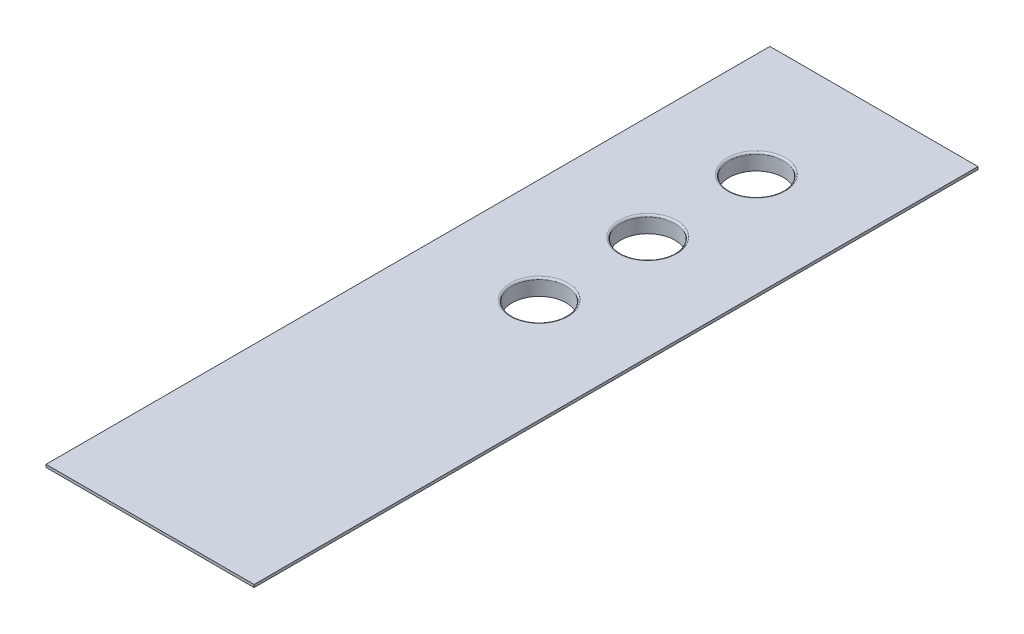
ISO-10303-21;
HEADER;
FILE_DESCRIPTION(('STEP AP214'),'2;1');
FILE_NAME('part.step','',(''),(''),'','','');
FILE_SCHEMA(('AUTOMOTIVE_DESIGN { 1 0 10303 214 1 1 1 1 }'));
ENDSEC;
DATA;
#1=APPLICATION_CONTEXT('core data for automotive mechanical design processes');
#2=APPLICATION_PROTOCOL_DEFINITION('international standard','automotive_design',2000,#1);
#3=PRODUCT_CONTEXT('',#1,'mechanical');
#4=PRODUCT('Part','Part','',(#3));
#5=PRODUCT_RELATED_PRODUCT_CATEGORY('part','',(#4));
#6=PRODUCT_DEFINITION_FORMATION('','',#4);
#7=PRODUCT_DEFINITION_CONTEXT('part definition',#1,'design');
#8=PRODUCT_DEFINITION('design','',#6,#7);
#9=PRODUCT_DEFINITION_SHAPE('','',#8);
#10=(LENGTH_UNIT() NAMED_UNIT(*) SI_UNIT(.MILLI.,.METRE.));
#11=(NAMED_UNIT(*) PLANE_ANGLE_UNIT() SI_UNIT($,.RADIAN.));
#12=(NAMED_UNIT(*) SI_UNIT($,.STERADIAN.) SOLID_ANGLE_UNIT());
#13=UNCERTAINTY_MEASURE_WITH_UNIT(LENGTH_MEASURE(1.E-05),#10,'distance_accuracy_value','');
#14=(GEOMETRIC_REPRESENTATION_CONTEXT(3) GLOBAL_UNCERTAINTY_ASSIGNED_CONTEXT((#13)) GLOBAL_UNIT_ASSIGNED_CONTEXT((#10,
#11,#12)) REPRESENTATION_CONTEXT('',''));
#15=CARTESIAN_POINT('',(0.,0.,0.));
#16=DIRECTION('',(0.,0.,1.));
#17=DIRECTION('',(1.,0.,0.));
#18=AXIS2_PLACEMENT_3D('',#15,#16,#17);
#19=CARTESIAN_POINT('',(-295.590216374017,-35.4988746672799,-138.330525501));
#20=DIRECTION('',(0.,1.,0.));
#21=DIRECTION('',(0.,0.,1.));
#22=AXIS2_PLACEMENT_3D('',#19,#20,#21);
#23=PLANE('',#22);
#24=CARTESIAN_POINT('',(-295.590216374017,-35.4988746672799,-138.330525501));
#25=DIRECTION('',(0.,1.,0.));
#26=DIRECTION('',(0.,0.,1.));
#27=AXIS2_PLACEMENT_3D('',#24,#25,#26);
#28=CIRCLE('',#27,3.29999999999997);
#29=CARTESIAN_POINT('',(-295.590216374017,-35.4988746672799,-135.030525501));
#30=VERTEX_POINT('',#29);
#31=EDGE_CURVE('E19',#30,#30,#28,.T.);
#32=ORIENTED_EDGE('',*,*,#31,.F.);
#33=EDGE_LOOP('',(#32));
#34=FACE_BOUND('',#33,.T.);
#35=CARTESIAN_POINT('',(-295.590216374017,-35.4988746672799,-138.330525501));
#36=DIRECTION('',(0.,1.,0.));
#37=DIRECTION('',(0.,0.,1.));
#38=AXIS2_PLACEMENT_3D('',#35,#36,#37);
#39=CIRCLE('',#38,3.);
#40=CARTESIAN_POINT('',(-295.590216374017,-35.4988746672799,-135.330525501));
#41=VERTEX_POINT('',#40);
#42=EDGE_CURVE('E165',#41,#41,#39,.T.);
#43=ORIENTED_EDGE('',*,*,#42,.T.);
#44=EDGE_LOOP('',(#43));
#45=FACE_BOUND('',#44,.T.);
#46=ADVANCED_FACE('F16',(#34,#45),#23,.F.);
#47=CARTESIAN_POINT('',(-295.590216374017,-35.4988746672799,-126.330525501));
#48=DIRECTION('',(0.,1.,0.));
#49=DIRECTION('',(0.,0.,1.));
#50=AXIS2_PLACEMENT_3D('',#47,#48,#49);
#51=PLANE('',#50);
#52=CARTESIAN_POINT('',(-295.590216374017,-35.4988746672799,-126.330525501));
#53=DIRECTION('',(0.,1.,0.));
#54=DIRECTION('',(0.,0.,1.));
#55=AXIS2_PLACEMENT_3D('',#52,#53,#54);
#56=CIRCLE('',#55,3.29999999999998);
#57=CARTESIAN_POINT('',(-295.590216374017,-35.4988746672799,-123.030525501));
#58=VERTEX_POINT('',#57);
#59=EDGE_CURVE('E170',#58,#58,#56,.T.);
#60=ORIENTED_EDGE('',*,*,#59,.F.);
#61=EDGE_LOOP('',(#60));
#62=FACE_BOUND('',#61,.T.);
#63=CARTESIAN_POINT('',(-295.590216374017,-35.4988746672799,-126.330525501));
#64=DIRECTION('',(0.,1.,0.));
#65=DIRECTION('',(0.,0.,1.));
#66=AXIS2_PLACEMENT_3D('',#63,#64,#65);
#67=CIRCLE('',#66,2.99999999999999);
#68=CARTESIAN_POINT('',(-295.590216374017,-35.4988746672799,-123.330525501));
#69=VERTEX_POINT('',#68);
#70=EDGE_CURVE('E162',#69,#69,#67,.T.);
#71=ORIENTED_EDGE('',*,*,#70,.T.);
#72=EDGE_LOOP('',(#71));
#73=FACE_BOUND('',#72,.T.);
#74=ADVANCED_FACE('F182',(#62,#73),#51,.F.);
#75=CARTESIAN_POINT('',(-295.590216374017,-35.4988746672799,-114.330525501));
#76=DIRECTION('',(0.,1.,0.));
#77=DIRECTION('',(0.,0.,1.));
#78=AXIS2_PLACEMENT_3D('',#75,#76,#77);
#79=PLANE('',#78);
#80=CARTESIAN_POINT('',(-295.590216374017,-35.4988746672799,-114.330525501));
#81=DIRECTION('',(0.,1.,0.));
#82=DIRECTION('',(0.,0.,1.));
#83=AXIS2_PLACEMENT_3D('',#80,#81,#82);
#84=CIRCLE('',#83,3.29999999999998);
#85=CARTESIAN_POINT('',(-295.590216374017,-35.4988746672799,-111.030525501));
#86=VERTEX_POINT('',#85);
#87=EDGE_CURVE('E168',#86,#86,#84,.T.);
#88=ORIENTED_EDGE('',*,*,#87,.F.);
#89=EDGE_LOOP('',(#88));
#90=FACE_BOUND('',#89,.T.);
#91=CARTESIAN_POINT('',(-295.590216374017,-35.4988746672799,-114.330525501));
#92=DIRECTION('',(0.,1.,0.));
#93=DIRECTION('',(0.,0.,1.));
#94=AXIS2_PLACEMENT_3D('',#91,#92,#93);
#95=CIRCLE('',#94,2.99999999999999);
#96=CARTESIAN_POINT('',(-295.590216374017,-35.4988746672799,-111.330525501));
#97=VERTEX_POINT('',#96);
#98=EDGE_CURVE('E159',#97,#97,#95,.T.);
#99=ORIENTED_EDGE('',*,*,#98,.T.);
#100=EDGE_LOOP('',(#99));
#101=FACE_BOUND('',#100,.T.);
#102=ADVANCED_FACE('F324',(#90,#101),#79,.F.);
#103=CARTESIAN_POINT('',(-295.590216374017,-35.4988746672799,-138.330525501));
#104=DIRECTION('',(0.,1.,0.));
#105=DIRECTION('',(0.,0.,1.));
#106=AXIS2_PLACEMENT_3D('',#103,#104,#105);
#107=CYLINDRICAL_SURFACE('',#106,3.29999999999997);
#108=ORIENTED_EDGE('',*,*,#31,.T.);
#109=EDGE_LOOP('',(#108));
#110=FACE_BOUND('',#109,.T.);
#111=CARTESIAN_POINT('',(-295.590216374017,-33.9988746672799,-138.330525501));
#112=DIRECTION('',(0.,1.,0.));
#113=DIRECTION('',(0.,0.,1.));
#114=AXIS2_PLACEMENT_3D('',#111,#112,#113);
#115=CIRCLE('',#114,3.29999999999997);
#116=CARTESIAN_POINT('',(-295.590216374017,-33.9988746672799,-135.030525501));
#117=VERTEX_POINT('',#116);
#118=EDGE_CURVE('E156',#117,#117,#115,.T.);
#119=ORIENTED_EDGE('',*,*,#118,.F.);
#120=EDGE_LOOP('',(#119));
#121=FACE_BOUND('',#120,.T.);
#122=ADVANCED_FACE('F177',(#110,#121),#107,.T.);
#123=CARTESIAN_POINT('',(-295.590216374017,-35.4988746672799,-126.330525501));
#124=DIRECTION('',(0.,1.,0.));
#125=DIRECTION('',(0.,0.,1.));
#126=AXIS2_PLACEMENT_3D('',#123,#124,#125);
#127=CYLINDRICAL_SURFACE('',#126,3.29999999999998);
#128=ORIENTED_EDGE('',*,*,#59,.T.);
#129=EDGE_LOOP('',(#128));
#130=FACE_BOUND('',#129,.T.);
#131=CARTESIAN_POINT('',(-295.590216374017,-33.9988746672799,-126.330525501));
#132=DIRECTION('',(0.,1.,0.));
#133=DIRECTION('',(0.,0.,1.));
#134=AXIS2_PLACEMENT_3D('',#131,#132,#133);
#135=CIRCLE('',#134,3.29999999999998);
#136=CARTESIAN_POINT('',(-295.590216374017,-33.9988746672799,-123.030525501));
#137=VERTEX_POINT('',#136);
#138=EDGE_CURVE('E153',#137,#137,#135,.T.);
#139=ORIENTED_EDGE('',*,*,#138,.F.);
#140=EDGE_LOOP('',(#139));
#141=FACE_BOUND('',#140,.T.);
#142=ADVANCED_FACE('F202',(#130,#141),#127,.T.);
#143=CARTESIAN_POINT('',(-295.590216374017,-35.4988746672799,-114.330525501));
#144=DIRECTION('',(0.,1.,0.));
#145=DIRECTION('',(0.,0.,1.));
#146=AXIS2_PLACEMENT_3D('',#143,#144,#145);
#147=CYLINDRICAL_SURFACE('',#146,3.29999999999998);
#148=ORIENTED_EDGE('',*,*,#87,.T.);
#149=EDGE_LOOP('',(#148));
#150=FACE_BOUND('',#149,.T.);
#151=CARTESIAN_POINT('',(-295.590216374017,-33.9988746672799,-114.330525501));
#152=DIRECTION('',(0.,1.,0.));
#153=DIRECTION('',(0.,0.,1.));
#154=AXIS2_PLACEMENT_3D('',#151,#152,#153);
#155=CIRCLE('',#154,3.29999999999998);
#156=CARTESIAN_POINT('',(-295.590216374017,-33.9988746672799,-111.030525501));
#157=VERTEX_POINT('',#156);
#158=EDGE_CURVE('E145',#157,#157,#155,.T.);
#159=ORIENTED_EDGE('',*,*,#158,.F.);
#160=EDGE_LOOP('',(#159));
#161=FACE_BOUND('',#160,.T.);
#162=ADVANCED_FACE('F189',(#150,#161),#147,.T.);
#163=CARTESIAN_POINT('',(-295.590216374017,-35.4988746672799,-138.330525501));
#164=DIRECTION('',(0.,1.,0.));
#165=DIRECTION('',(0.,0.,1.));
#166=AXIS2_PLACEMENT_3D('',#163,#164,#165);
#167=CYLINDRICAL_SURFACE('',#166,3.);
#168=ORIENTED_EDGE('',*,*,#42,.F.);
#169=EDGE_LOOP('',(#168));
#170=FACE_BOUND('',#169,.T.);
#171=CARTESIAN_POINT('',(-295.590216374017,-33.8988746672799,-138.330525501));
#172=DIRECTION('',(0.,-1.,0.));
#173=DIRECTION('',(0.,0.,-1.));
#174=AXIS2_PLACEMENT_3D('',#171,#172,#173);
#175=CIRCLE('',#174,3.);
#176=CARTESIAN_POINT('',(-295.590216374017,-33.8988746672799,-141.330525501));
#177=VERTEX_POINT('',#176);
#178=EDGE_CURVE('E114',#177,#177,#175,.T.);
#179=ORIENTED_EDGE('',*,*,#178,.F.);
#180=EDGE_LOOP('',(#179));
#181=FACE_BOUND('',#180,.T.);
#182=ADVANCED_FACE('F185',(#170,#181),#167,.F.);
#183=CARTESIAN_POINT('',(-295.590216374017,-35.4988746672799,-126.330525501));
#184=DIRECTION('',(0.,1.,0.));
#185=DIRECTION('',(0.,0.,1.));
#186=AXIS2_PLACEMENT_3D('',#183,#184,#185);
#187=CYLINDRICAL_SURFACE('',#186,2.99999999999999);
#188=ORIENTED_EDGE('',*,*,#70,.F.);
#189=EDGE_LOOP('',(#188));
#190=FACE_BOUND('',#189,.T.);
#191=CARTESIAN_POINT('',(-295.590216374017,-33.8988746672799,-126.330525501));
#192=DIRECTION('',(0.,-1.,0.));
#193=DIRECTION('',(0.,0.,-1.));
#194=AXIS2_PLACEMENT_3D('',#191,#192,#193);
#195=CIRCLE('',#194,3.);
#196=CARTESIAN_POINT('',(-295.590216374017,-33.8988746672799,-129.330525501));
#197=VERTEX_POINT('',#196);
#198=EDGE_CURVE('E111',#197,#197,#195,.T.);
#199=ORIENTED_EDGE('',*,*,#198,.F.);
#200=EDGE_LOOP('',(#199));
#201=FACE_BOUND('',#200,.T.);
#202=ADVANCED_FACE('F188',(#190,#201),#187,.F.);
#203=CARTESIAN_POINT('',(-295.590216374017,-35.4988746672799,-114.330525501));
#204=DIRECTION('',(0.,1.,0.));
#205=DIRECTION('',(0.,0.,1.));
#206=AXIS2_PLACEMENT_3D('',#203,#204,#205);
#207=CYLINDRICAL_SURFACE('',#206,2.99999999999999);
#208=ORIENTED_EDGE('',*,*,#98,.F.);
#209=EDGE_LOOP('',(#208));
#210=FACE_BOUND('',#209,.T.);
#211=CARTESIAN_POINT('',(-295.590216374017,-33.8988746672799,-114.330525501));
#212=DIRECTION('',(0.,-1.,0.));
#213=DIRECTION('',(0.,0.,-1.));
#214=AXIS2_PLACEMENT_3D('',#211,#212,#213);
#215=CIRCLE('',#214,2.99999999999999);
#216=CARTESIAN_POINT('',(-295.590216374017,-33.8988746672799,-117.330525501));
#217=VERTEX_POINT('',#216);
#218=EDGE_CURVE('E75',#217,#217,#215,.T.);
#219=ORIENTED_EDGE('',*,*,#218,.F.);
#220=EDGE_LOOP('',(#219));
#221=FACE_BOUND('',#220,.T.);
#222=ADVANCED_FACE('F199',(#210,#221),#207,.F.);
#223=CARTESIAN_POINT('',(0.,-33.9988746672798,0.));
#224=DIRECTION('',(0.,-1.,0.));
#225=DIRECTION('',(0.,0.,-1.));
#226=AXIS2_PLACEMENT_3D('',#223,#224,#225);
#227=PLANE('',#226);
#228=DIRECTION('',(0.,0.,1.));
#229=VECTOR('',#228,1.);
#230=CARTESIAN_POINT('',(-307.090216374017,-33.9988746672799,-101.330525501));
#231=LINE('',#230,#229);
#232=CARTESIAN_POINT('',(-307.090216374017,-33.9988746672799,-151.330525501));
#233=VERTEX_POINT('',#232);
#234=CARTESIAN_POINT('',(-307.090216374017,-33.9988746672799,-71.3305255010001));
#235=VERTEX_POINT('',#234);
#236=EDGE_CURVE('E66',#233,#235,#231,.T.);
#237=ORIENTED_EDGE('',*,*,#236,.F.);
#238=DIRECTION('',(1.,0.,0.));
#239=VECTOR('',#238,1.);
#240=CARTESIAN_POINT('',(-307.090216374017,-33.9988746672799,-151.330525501));
#241=LINE('',#240,#239);
#242=CARTESIAN_POINT('',(-284.090216374017,-33.9988746672799,-151.330525501));
#243=VERTEX_POINT('',#242);
#244=EDGE_CURVE('E57',#243,#233,#241,.F.);
#245=ORIENTED_EDGE('',*,*,#244,.F.);
#246=DIRECTION('',(0.,0.,1.));
#247=VECTOR('',#246,1.);
#248=CARTESIAN_POINT('',(-284.090216374017,-33.9988746672799,-101.330525501));
#249=LINE('',#248,#247);
#250=CARTESIAN_POINT('',(-284.090216374017,-33.9988746672799,-71.3305255010001));
#251=VERTEX_POINT('',#250);
#252=EDGE_CURVE('E52',#251,#243,#249,.F.);
#253=ORIENTED_EDGE('',*,*,#252,.F.);
#254=DIRECTION('',(1.,0.,0.));
#255=VECTOR('',#254,1.);
#256=CARTESIAN_POINT('',(-307.090216374017,-33.9988746672799,-71.3305255010001));
#257=LINE('',#256,#255);
#258=EDGE_CURVE('E71',#235,#251,#257,.T.);
#259=ORIENTED_EDGE('',*,*,#258,.F.);
#260=EDGE_LOOP('',(#237,#245,#253,#259));
#261=FACE_BOUND('',#260,.T.);
#262=ORIENTED_EDGE('',*,*,#158,.T.);
#263=EDGE_LOOP('',(#262));
#264=FACE_BOUND('',#263,.T.);
#265=ORIENTED_EDGE('',*,*,#138,.T.);
#266=EDGE_LOOP('',(#265));
#267=FACE_BOUND('',#266,.T.);
#268=ORIENTED_EDGE('',*,*,#118,.T.);
#269=EDGE_LOOP('',(#268));
#270=FACE_BOUND('',#269,.T.);
#271=ADVANCED_FACE('F69',(#261,#264,#267,#270),#227,.T.);
#272=CARTESIAN_POINT('',(-295.590216374017,-33.8988746672799,-138.330525501));
#273=DIRECTION('',(0.,-1.,0.));
#274=DIRECTION('',(0.,0.,-1.));
#275=AXIS2_PLACEMENT_3D('',#272,#273,#274);
#276=TOROIDAL_SURFACE('',#275,3.20000000000001,0.2);
#277=CARTESIAN_POINT('',(-295.590216374017,-33.6988746672799,-138.330525501));
#278=DIRECTION('',(0.,1.,0.));
#279=DIRECTION('',(0.,0.,-1.));
#280=AXIS2_PLACEMENT_3D('',#277,#278,#279);
#281=CIRCLE('',#280,3.19999999999998);
#282=CARTESIAN_POINT('',(-295.590216374017,-33.6988746672799,-141.530525501));
#283=VERTEX_POINT('',#282);
#284=EDGE_CURVE('E252',#283,#283,#281,.T.);
#285=ORIENTED_EDGE('',*,*,#284,.T.);
#286=EDGE_LOOP('',(#285));
#287=FACE_BOUND('',#286,.T.);
#288=ORIENTED_EDGE('',*,*,#178,.T.);
#289=EDGE_LOOP('',(#288));
#290=FACE_BOUND('',#289,.T.);
#291=ADVANCED_FACE('F133',(#287,#290),#276,.T.);
#292=CARTESIAN_POINT('',(-295.590216374017,-33.8988746672799,-126.330525501));
#293=DIRECTION('',(0.,-1.,0.));
#294=DIRECTION('',(0.,0.,-1.));
#295=AXIS2_PLACEMENT_3D('',#292,#293,#294);
#296=TOROIDAL_SURFACE('',#295,3.20000000000001,0.2);
#297=CARTESIAN_POINT('',(-295.590216374017,-33.6988746672799,-126.330525501));
#298=DIRECTION('',(0.,1.,0.));
#299=DIRECTION('',(0.,0.,-1.));
#300=AXIS2_PLACEMENT_3D('',#297,#298,#299);
#301=CIRCLE('',#300,3.20000000000001);
#302=CARTESIAN_POINT('',(-295.590216374017,-33.6988746672799,-129.530525501));
#303=VERTEX_POINT('',#302);
#304=EDGE_CURVE('E121',#303,#303,#301,.T.);
#305=ORIENTED_EDGE('',*,*,#304,.T.);
#306=EDGE_LOOP('',(#305));
#307=FACE_BOUND('',#306,.T.);
#308=ORIENTED_EDGE('',*,*,#198,.T.);
#309=EDGE_LOOP('',(#308));
#310=FACE_BOUND('',#309,.T.);
#311=ADVANCED_FACE('F93',(#307,#310),#296,.T.);
#312=CARTESIAN_POINT('',(-295.590216374017,-33.8988746672799,-114.330525501));
#313=DIRECTION('',(0.,-1.,0.));
#314=DIRECTION('',(0.,0.,-1.));
#315=AXIS2_PLACEMENT_3D('',#312,#313,#314);
#316=TOROIDAL_SURFACE('',#315,3.19999999999999,0.2);
#317=CARTESIAN_POINT('',(-295.590216374017,-33.6988746672799,-114.330525501));
#318=DIRECTION('',(0.,1.,0.));
#319=DIRECTION('',(0.,0.,-1.));
#320=AXIS2_PLACEMENT_3D('',#317,#318,#319);
#321=CIRCLE('',#320,3.19999999999998);
#322=CARTESIAN_POINT('',(-295.590216374017,-33.6988746672799,-117.530525501));
#323=VERTEX_POINT('',#322);
#324=EDGE_CURVE('E237',#323,#323,#321,.T.);
#325=ORIENTED_EDGE('',*,*,#324,.T.);
#326=EDGE_LOOP('',(#325));
#327=FACE_BOUND('',#326,.T.);
#328=ORIENTED_EDGE('',*,*,#218,.T.);
#329=EDGE_LOOP('',(#328));
#330=FACE_BOUND('',#329,.T.);
#331=ADVANCED_FACE('F88',(#327,#330),#316,.T.);
#332=CARTESIAN_POINT('',(-307.090216374017,-33.6988746672799,-101.330525501));
#333=DIRECTION('',(-1.,0.,0.));
#334=DIRECTION('',(0.,-1.,0.));
#335=AXIS2_PLACEMENT_3D('',#332,#333,#334);
#336=PLANE('',#335);
#337=ORIENTED_EDGE('',*,*,#236,.T.);
#338=DIRECTION('',(0.,-1.,0.));
#339=VECTOR('',#338,1.);
#340=CARTESIAN_POINT('',(-307.090216374017,-33.6988746672798,-71.3305255010001));
#341=LINE('',#340,#339);
#342=CARTESIAN_POINT('',(-307.090216374017,-33.6988746672798,-71.3305255010001));
#343=VERTEX_POINT('',#342);
#344=EDGE_CURVE('E254',#343,#235,#341,.T.);
#345=ORIENTED_EDGE('',*,*,#344,.F.);
#346=DIRECTION('',(0.,0.,-1.));
#347=VECTOR('',#346,1.);
#348=CARTESIAN_POINT('',(-307.090216374017,-33.6988746672798,0.));
#349=LINE('',#348,#347);
#350=CARTESIAN_POINT('',(-307.090216374017,-33.6988746672799,-151.330525501));
#351=VERTEX_POINT('',#350);
#352=EDGE_CURVE('E79',#343,#351,#349,.T.);
#353=ORIENTED_EDGE('',*,*,#352,.T.);
#354=DIRECTION('',(0.,1.,0.));
#355=VECTOR('',#354,1.);
#356=CARTESIAN_POINT('',(-307.090216374017,-33.6988746672799,-151.330525501));
#357=LINE('',#356,#355);
#358=EDGE_CURVE('E62',#233,#351,#357,.T.);
#359=ORIENTED_EDGE('',*,*,#358,.F.);
#360=EDGE_LOOP('',(#337,#345,#353,#359));
#361=FACE_BOUND('',#360,.T.);
#362=ADVANCED_FACE('F78',(#361),#336,.T.);
#363=CARTESIAN_POINT('',(-307.090216374017,-33.6988746672799,-151.330525501));
#364=DIRECTION('',(0.,0.,-1.));
#365=DIRECTION('',(0.,1.,0.));
#366=AXIS2_PLACEMENT_3D('',#363,#364,#365);
#367=PLANE('',#366);
#368=ORIENTED_EDGE('',*,*,#244,.T.);
#369=ORIENTED_EDGE('',*,*,#358,.T.);
#370=DIRECTION('',(1.,0.,0.));
#371=VECTOR('',#370,1.);
#372=CARTESIAN_POINT('',(0.,-33.6988746672799,-151.330525501));
#373=LINE('',#372,#371);
#374=CARTESIAN_POINT('',(-284.090216374017,-33.6988746672799,-151.330525501));
#375=VERTEX_POINT('',#374);
#376=EDGE_CURVE('E248',#351,#375,#373,.T.);
#377=ORIENTED_EDGE('',*,*,#376,.T.);
#378=DIRECTION('',(0.,1.,0.));
#379=VECTOR('',#378,1.);
#380=CARTESIAN_POINT('',(-284.090216374017,-33.6988746672799,-151.330525501));
#381=LINE('',#380,#379);
#382=EDGE_CURVE('E64',#243,#375,#381,.T.);
#383=ORIENTED_EDGE('',*,*,#382,.F.);
#384=EDGE_LOOP('',(#368,#369,#377,#383));
#385=FACE_BOUND('',#384,.T.);
#386=ADVANCED_FACE('F59',(#385),#367,.T.);
#387=CARTESIAN_POINT('',(-284.090216374017,-33.6988746672799,-101.330525501));
#388=DIRECTION('',(1.,0.,0.));
#389=DIRECTION('',(0.,1.,0.));
#390=AXIS2_PLACEMENT_3D('',#387,#388,#389);
#391=PLANE('',#390);
#392=ORIENTED_EDGE('',*,*,#252,.T.);
#393=ORIENTED_EDGE('',*,*,#382,.T.);
#394=DIRECTION('',(0.,0.,-1.));
#395=VECTOR('',#394,1.);
#396=CARTESIAN_POINT('',(-284.090216374017,-33.6988746672798,0.));
#397=LINE('',#396,#395);
#398=CARTESIAN_POINT('',(-284.090216374017,-33.6988746672799,-71.3305255010001));
#399=VERTEX_POINT('',#398);
#400=EDGE_CURVE('E25',#375,#399,#397,.F.);
#401=ORIENTED_EDGE('',*,*,#400,.T.);
#402=DIRECTION('',(0.,-1.,0.));
#403=VECTOR('',#402,1.);
#404=CARTESIAN_POINT('',(-284.090216374017,-33.6988746672798,-71.3305255010001));
#405=LINE('',#404,#403);
#406=EDGE_CURVE('E33',#251,#399,#405,.F.);
#407=ORIENTED_EDGE('',*,*,#406,.F.);
#408=EDGE_LOOP('',(#392,#393,#401,#407));
#409=FACE_BOUND('',#408,.T.);
#410=ADVANCED_FACE('F213',(#409),#391,.T.);
#411=CARTESIAN_POINT('',(-307.090216374017,-33.6988746672798,-71.3305255010001));
#412=DIRECTION('',(0.,0.,1.));
#413=DIRECTION('',(0.,-1.,0.));
#414=AXIS2_PLACEMENT_3D('',#411,#412,#413);
#415=PLANE('',#414);
#416=ORIENTED_EDGE('',*,*,#258,.T.);
#417=ORIENTED_EDGE('',*,*,#406,.T.);
#418=DIRECTION('',(1.,0.,0.));
#419=VECTOR('',#418,1.);
#420=CARTESIAN_POINT('',(0.,-33.6988746672798,-71.3305255010001));
#421=LINE('',#420,#419);
#422=EDGE_CURVE('E11',#399,#343,#421,.F.);
#423=ORIENTED_EDGE('',*,*,#422,.T.);
#424=ORIENTED_EDGE('',*,*,#344,.T.);
#425=EDGE_LOOP('',(#416,#417,#423,#424));
#426=FACE_BOUND('',#425,.T.);
#427=ADVANCED_FACE('F207',(#426),#415,.T.);
#428=CARTESIAN_POINT('',(0.,-33.6988746672798,0.));
#429=DIRECTION('',(0.,-1.,0.));
#430=DIRECTION('',(0.,0.,-1.));
#431=AXIS2_PLACEMENT_3D('',#428,#429,#430);
#432=PLANE('',#431);
#433=ORIENTED_EDGE('',*,*,#400,.F.);
#434=ORIENTED_EDGE('',*,*,#376,.F.);
#435=ORIENTED_EDGE('',*,*,#352,.F.);
#436=ORIENTED_EDGE('',*,*,#422,.F.);
#437=EDGE_LOOP('',(#433,#434,#435,#436));
#438=FACE_BOUND('',#437,.T.);
#439=ORIENTED_EDGE('',*,*,#324,.F.);
#440=EDGE_LOOP('',(#439));
#441=FACE_BOUND('',#440,.T.);
#442=ORIENTED_EDGE('',*,*,#304,.F.);
#443=EDGE_LOOP('',(#442));
#444=FACE_BOUND('',#443,.T.);
#445=ORIENTED_EDGE('',*,*,#284,.F.);
#446=EDGE_LOOP('',(#445));
#447=FACE_BOUND('',#446,.T.);
#448=ADVANCED_FACE('F205',(#438,#441,#444,#447),#432,.F.);
#449=CLOSED_SHELL('',(#46,#74,#102,#122,#142,#162,#182,#202,#222,#271,#291,#311,#331,#362,#386,
#410,#427,#448));
#450=MANIFOLD_SOLID_BREP('B1',#449);
#451=ADVANCED_BREP_SHAPE_REPRESENTATION('',(#18,#450),#14);
#452=SHAPE_DEFINITION_REPRESENTATION(#9,#451);
ENDSEC;
END-ISO-10303-21;
